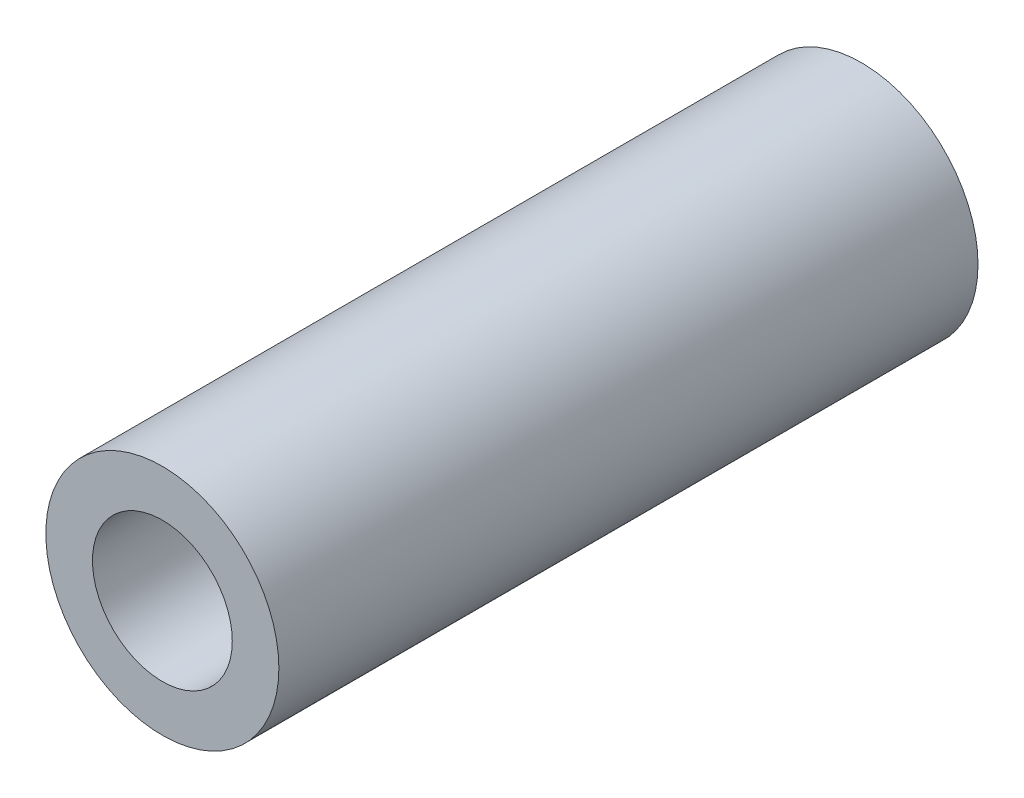
ISO-10303-21;
HEADER;
FILE_DESCRIPTION(('STEP AP214'),'2;1');
FILE_NAME('part.step','',(''),(''),'','','');
FILE_SCHEMA(('AUTOMOTIVE_DESIGN { 1 0 10303 214 1 1 1 1 }'));
ENDSEC;
DATA;
#1=APPLICATION_CONTEXT('core data for automotive mechanical design processes');
#2=APPLICATION_PROTOCOL_DEFINITION('international standard','automotive_design',2000,#1);
#3=PRODUCT_CONTEXT('',#1,'mechanical');
#4=PRODUCT('Part','Part','',(#3));
#5=PRODUCT_RELATED_PRODUCT_CATEGORY('part','',(#4));
#6=PRODUCT_DEFINITION_FORMATION('','',#4);
#7=PRODUCT_DEFINITION_CONTEXT('part definition',#1,'design');
#8=PRODUCT_DEFINITION('design','',#6,#7);
#9=PRODUCT_DEFINITION_SHAPE('','',#8);
#10=(LENGTH_UNIT() NAMED_UNIT(*) SI_UNIT(.MILLI.,.METRE.));
#11=(NAMED_UNIT(*) PLANE_ANGLE_UNIT() SI_UNIT($,.RADIAN.));
#12=(NAMED_UNIT(*) SI_UNIT($,.STERADIAN.) SOLID_ANGLE_UNIT());
#13=UNCERTAINTY_MEASURE_WITH_UNIT(LENGTH_MEASURE(1.E-05),#10,'distance_accuracy_value','');
#14=(GEOMETRIC_REPRESENTATION_CONTEXT(3) GLOBAL_UNCERTAINTY_ASSIGNED_CONTEXT((#13)) GLOBAL_UNIT_ASSIGNED_CONTEXT((#10,
#11,#12)) REPRESENTATION_CONTEXT('',''));
#15=CARTESIAN_POINT('',(0.,0.,0.));
#16=DIRECTION('',(0.,0.,1.));
#17=DIRECTION('',(1.,0.,0.));
#18=AXIS2_PLACEMENT_3D('',#15,#16,#17);
#19=CARTESIAN_POINT('',(-25.0328596927803,16.5334792346189,15.));
#20=DIRECTION('',(0.,0.,1.));
#21=DIRECTION('',(1.,0.,0.));
#22=AXIS2_PLACEMENT_3D('',#19,#20,#21);
#23=PLANE('',#22);
#24=CARTESIAN_POINT('',(-25.0328596927803,16.5334792346189,15.));
#25=DIRECTION('',(0.,0.,1.));
#26=DIRECTION('',(1.,0.,0.));
#27=AXIS2_PLACEMENT_3D('',#24,#25,#26);
#28=CIRCLE('',#27,2.5);
#29=CARTESIAN_POINT('',(-22.5328596927803,16.5334792346189,15.));
#30=VERTEX_POINT('',#29);
#31=EDGE_CURVE('E10',#30,#30,#28,.T.);
#32=ORIENTED_EDGE('',*,*,#31,.T.);
#33=EDGE_LOOP('',(#32));
#34=FACE_BOUND('',#33,.T.);
#35=CARTESIAN_POINT('',(-25.0328596927803,16.5334792346189,15.));
#36=DIRECTION('',(0.,0.,1.));
#37=DIRECTION('',(1.,0.,0.));
#38=AXIS2_PLACEMENT_3D('',#35,#36,#37);
#39=CIRCLE('',#38,1.5);
#40=CARTESIAN_POINT('',(-23.5328596927803,16.5334792346189,15.));
#41=VERTEX_POINT('',#40);
#42=EDGE_CURVE('E42',#41,#41,#39,.T.);
#43=ORIENTED_EDGE('',*,*,#42,.F.);
#44=EDGE_LOOP('',(#43));
#45=FACE_BOUND('',#44,.T.);
#46=ADVANCED_FACE('F31',(#34,#45),#23,.T.);
#47=CARTESIAN_POINT('',(-25.0328596927803,16.5334792346189,0.));
#48=DIRECTION('',(0.,0.,1.));
#49=DIRECTION('',(1.,0.,0.));
#50=AXIS2_PLACEMENT_3D('',#47,#48,#49);
#51=PLANE('',#50);
#52=CARTESIAN_POINT('',(-25.0328596927803,16.5334792346189,0.));
#53=DIRECTION('',(0.,0.,1.));
#54=DIRECTION('',(1.,0.,0.));
#55=AXIS2_PLACEMENT_3D('',#52,#53,#54);
#56=CIRCLE('',#55,2.5);
#57=CARTESIAN_POINT('',(-22.5328596927803,16.5334792346189,0.));
#58=VERTEX_POINT('',#57);
#59=EDGE_CURVE('E35',#58,#58,#56,.T.);
#60=ORIENTED_EDGE('',*,*,#59,.F.);
#61=EDGE_LOOP('',(#60));
#62=FACE_BOUND('',#61,.T.);
#63=CARTESIAN_POINT('',(-25.0328596927803,16.5334792346189,0.));
#64=DIRECTION('',(0.,0.,1.));
#65=DIRECTION('',(1.,0.,0.));
#66=AXIS2_PLACEMENT_3D('',#63,#64,#65);
#67=CIRCLE('',#66,1.5);
#68=CARTESIAN_POINT('',(-23.5328596927803,16.5334792346189,0.));
#69=VERTEX_POINT('',#68);
#70=EDGE_CURVE('E44',#69,#69,#67,.T.);
#71=ORIENTED_EDGE('',*,*,#70,.T.);
#72=EDGE_LOOP('',(#71));
#73=FACE_BOUND('',#72,.T.);
#74=ADVANCED_FACE('F54',(#62,#73),#51,.F.);
#75=CARTESIAN_POINT('',(-25.0328596927803,16.5334792346189,15.));
#76=DIRECTION('',(0.,0.,-1.));
#77=DIRECTION('',(-1.,0.,0.));
#78=AXIS2_PLACEMENT_3D('',#75,#76,#77);
#79=CYLINDRICAL_SURFACE('',#78,2.5);
#80=ORIENTED_EDGE('',*,*,#31,.F.);
#81=EDGE_LOOP('',(#80));
#82=FACE_BOUND('',#81,.T.);
#83=ORIENTED_EDGE('',*,*,#59,.T.);
#84=EDGE_LOOP('',(#83));
#85=FACE_BOUND('',#84,.T.);
#86=ADVANCED_FACE('F33',(#82,#85),#79,.T.);
#87=CARTESIAN_POINT('',(-25.0328596927803,16.5334792346189,15.));
#88=DIRECTION('',(0.,0.,-1.));
#89=DIRECTION('',(-1.,0.,0.));
#90=AXIS2_PLACEMENT_3D('',#87,#88,#89);
#91=CYLINDRICAL_SURFACE('',#90,1.5);
#92=ORIENTED_EDGE('',*,*,#42,.T.);
#93=EDGE_LOOP('',(#92));
#94=FACE_BOUND('',#93,.T.);
#95=ORIENTED_EDGE('',*,*,#70,.F.);
#96=EDGE_LOOP('',(#95));
#97=FACE_BOUND('',#96,.T.);
#98=ADVANCED_FACE('F50',(#94,#97),#91,.F.);
#99=CLOSED_SHELL('',(#46,#74,#86,#98));
#100=MANIFOLD_SOLID_BREP('B2',#99);
#101=ADVANCED_BREP_SHAPE_REPRESENTATION('',(#18,#100),#14);
#102=SHAPE_DEFINITION_REPRESENTATION(#9,#101);
ENDSEC;
END-ISO-10303-21;
